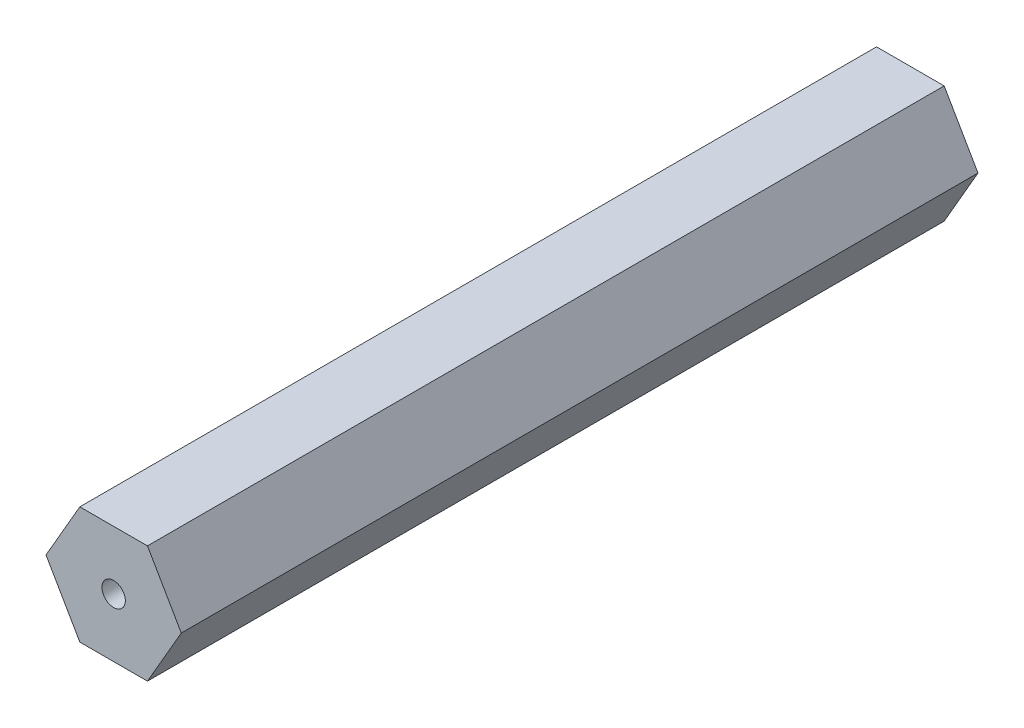
ISO-10303-21;
HEADER;
FILE_DESCRIPTION(('STEP AP214'),'2;1');
FILE_NAME('part.step','',(''),(''),'','','');
FILE_SCHEMA(('AUTOMOTIVE_DESIGN { 1 0 10303 214 1 1 1 1 }'));
ENDSEC;
DATA;
#1=APPLICATION_CONTEXT('core data for automotive mechanical design processes');
#2=APPLICATION_PROTOCOL_DEFINITION('international standard','automotive_design',2000,#1);
#3=PRODUCT_CONTEXT('',#1,'mechanical');
#4=PRODUCT('Part','Part','',(#3));
#5=PRODUCT_RELATED_PRODUCT_CATEGORY('part','',(#4));
#6=PRODUCT_DEFINITION_FORMATION('','',#4);
#7=PRODUCT_DEFINITION_CONTEXT('part definition',#1,'design');
#8=PRODUCT_DEFINITION('design','',#6,#7);
#9=PRODUCT_DEFINITION_SHAPE('','',#8);
#10=(LENGTH_UNIT() NAMED_UNIT(*) SI_UNIT(.MILLI.,.METRE.));
#11=(NAMED_UNIT(*) PLANE_ANGLE_UNIT() SI_UNIT($,.RADIAN.));
#12=(NAMED_UNIT(*) SI_UNIT($,.STERADIAN.) SOLID_ANGLE_UNIT());
#13=UNCERTAINTY_MEASURE_WITH_UNIT(LENGTH_MEASURE(1.E-05),#10,'distance_accuracy_value','');
#14=(GEOMETRIC_REPRESENTATION_CONTEXT(3) GLOBAL_UNCERTAINTY_ASSIGNED_CONTEXT((#13)) GLOBAL_UNIT_ASSIGNED_CONTEXT((#10,
#11,#12)) REPRESENTATION_CONTEXT('',''));
#15=CARTESIAN_POINT('',(0.,0.,0.));
#16=DIRECTION('',(0.,0.,1.));
#17=DIRECTION('',(1.,0.,0.));
#18=AXIS2_PLACEMENT_3D('',#15,#16,#17);
#19=CARTESIAN_POINT('',(0.,0.,86.36));
#20=DIRECTION('',(0.,0.,1.));
#21=DIRECTION('',(1.,0.,0.));
#22=AXIS2_PLACEMENT_3D('',#19,#20,#21);
#23=PLANE('',#22);
#24=DIRECTION('',(0.499999999999995,0.866025403784441,0.));
#25=VECTOR('',#24,1.);
#26=CARTESIAN_POINT('',(4.76927087411562,-5.16579328635903,86.36));
#27=LINE('',#26,#25);
#28=CARTESIAN_POINT('',(4.76927087411562,-5.16579328635903,86.36));
#29=VERTEX_POINT('',#28);
#30=CARTESIAN_POINT('',(8.43544508346967,1.18420671364094,86.36));
#31=VERTEX_POINT('',#30);
#32=EDGE_CURVE('E150',#29,#31,#27,.T.);
#33=ORIENTED_EDGE('',*,*,#32,.T.);
#34=DIRECTION('',(-0.500000000000001,0.866025403784438,0.));
#35=VECTOR('',#34,1.);
#36=CARTESIAN_POINT('',(8.43544508346967,1.18420671364094,86.36));
#37=LINE('',#36,#35);
#38=CARTESIAN_POINT('',(4.76927087411553,7.53420671364095,86.36));
#39=VERTEX_POINT('',#38);
#40=EDGE_CURVE('E98',#31,#39,#37,.T.);
#41=ORIENTED_EDGE('',*,*,#40,.T.);
#42=DIRECTION('',(-1.,0.,0.));
#43=VECTOR('',#42,1.);
#44=CARTESIAN_POINT('',(4.76927087411553,7.53420671364095,86.36));
#45=LINE('',#44,#43);
#46=CARTESIAN_POINT('',(-2.56307754459274,7.53420671364093,86.36));
#47=VERTEX_POINT('',#46);
#48=EDGE_CURVE('E111',#39,#47,#45,.T.);
#49=ORIENTED_EDGE('',*,*,#48,.T.);
#50=DIRECTION('',(-0.499999999999995,-0.866025403784441,0.));
#51=VECTOR('',#50,1.);
#52=CARTESIAN_POINT('',(-2.56307754459274,7.53420671364093,86.36));
#53=LINE('',#52,#51);
#54=CARTESIAN_POINT('',(-6.22925175394683,1.18420671364089,86.36));
#55=VERTEX_POINT('',#54);
#56=EDGE_CURVE('E105',#47,#55,#53,.T.);
#57=ORIENTED_EDGE('',*,*,#56,.T.);
#58=DIRECTION('',(0.500000000000007,-0.866025403784435,0.));
#59=VECTOR('',#58,1.);
#60=CARTESIAN_POINT('',(-6.22925175394683,1.18420671364089,86.36));
#61=LINE('',#60,#59);
#62=CARTESIAN_POINT('',(-2.56307754459265,-5.1657932863591,86.36));
#63=VERTEX_POINT('',#62);
#64=EDGE_CURVE('E109',#55,#63,#61,.T.);
#65=ORIENTED_EDGE('',*,*,#64,.T.);
#66=DIRECTION('',(1.,0.,0.));
#67=VECTOR('',#66,1.);
#68=CARTESIAN_POINT('',(-2.56307754459265,-5.1657932863591,86.36));
#69=LINE('',#68,#67);
#70=EDGE_CURVE('E61',#63,#29,#69,.T.);
#71=ORIENTED_EDGE('',*,*,#70,.T.);
#72=EDGE_LOOP('',(#33,#41,#49,#57,#65,#71));
#73=FACE_BOUND('',#72,.T.);
#74=CARTESIAN_POINT('',(1.10309666476142,1.18420671364094,86.36));
#75=DIRECTION('',(0.,0.,1.));
#76=DIRECTION('',(1.,0.,0.));
#77=AXIS2_PLACEMENT_3D('',#74,#75,#76);
#78=CIRCLE('',#77,1.27);
#79=CARTESIAN_POINT('',(2.37309666476142,1.18420671364094,86.36));
#80=VERTEX_POINT('',#79);
#81=EDGE_CURVE('E138',#80,#80,#78,.T.);
#82=ORIENTED_EDGE('',*,*,#81,.F.);
#83=EDGE_LOOP('',(#82));
#84=FACE_BOUND('',#83,.T.);
#85=ADVANCED_FACE('F43',(#73,#84),#23,.T.);
#86=CARTESIAN_POINT('',(0.,0.,0.));
#87=DIRECTION('',(0.,0.,1.));
#88=DIRECTION('',(1.,0.,0.));
#89=AXIS2_PLACEMENT_3D('',#86,#87,#88);
#90=PLANE('',#89);
#91=DIRECTION('',(0.499999999999995,0.866025403784441,0.));
#92=VECTOR('',#91,1.);
#93=CARTESIAN_POINT('',(4.76927087411562,-5.16579328635903,0.));
#94=LINE('',#93,#92);
#95=CARTESIAN_POINT('',(4.76927087411562,-5.16579328635903,0.));
#96=VERTEX_POINT('',#95);
#97=CARTESIAN_POINT('',(8.43544508346967,1.18420671364094,0.));
#98=VERTEX_POINT('',#97);
#99=EDGE_CURVE('E133',#96,#98,#94,.T.);
#100=ORIENTED_EDGE('',*,*,#99,.F.);
#101=DIRECTION('',(1.,0.,0.));
#102=VECTOR('',#101,1.);
#103=CARTESIAN_POINT('',(-2.56307754459265,-5.1657932863591,0.));
#104=LINE('',#103,#102);
#105=CARTESIAN_POINT('',(-2.56307754459265,-5.1657932863591,0.));
#106=VERTEX_POINT('',#105);
#107=EDGE_CURVE('E90',#106,#96,#104,.T.);
#108=ORIENTED_EDGE('',*,*,#107,.F.);
#109=DIRECTION('',(0.500000000000007,-0.866025403784435,0.));
#110=VECTOR('',#109,1.);
#111=CARTESIAN_POINT('',(-6.22925175394683,1.18420671364089,0.));
#112=LINE('',#111,#110);
#113=CARTESIAN_POINT('',(-6.22925175394683,1.18420671364089,0.));
#114=VERTEX_POINT('',#113);
#115=EDGE_CURVE('E84',#114,#106,#112,.T.);
#116=ORIENTED_EDGE('',*,*,#115,.F.);
#117=DIRECTION('',(-0.499999999999995,-0.866025403784441,0.));
#118=VECTOR('',#117,1.);
#119=CARTESIAN_POINT('',(-2.56307754459274,7.53420671364093,0.));
#120=LINE('',#119,#118);
#121=CARTESIAN_POINT('',(-2.56307754459274,7.53420671364093,0.));
#122=VERTEX_POINT('',#121);
#123=EDGE_CURVE('E120',#122,#114,#120,.T.);
#124=ORIENTED_EDGE('',*,*,#123,.F.);
#125=DIRECTION('',(-1.,0.,0.));
#126=VECTOR('',#125,1.);
#127=CARTESIAN_POINT('',(4.76927087411553,7.53420671364095,0.));
#128=LINE('',#127,#126);
#129=CARTESIAN_POINT('',(4.76927087411553,7.53420671364095,0.));
#130=VERTEX_POINT('',#129);
#131=EDGE_CURVE('E141',#130,#122,#128,.T.);
#132=ORIENTED_EDGE('',*,*,#131,.F.);
#133=DIRECTION('',(-0.500000000000001,0.866025403784438,0.));
#134=VECTOR('',#133,1.);
#135=CARTESIAN_POINT('',(8.43544508346967,1.18420671364094,0.));
#136=LINE('',#135,#134);
#137=EDGE_CURVE('E137',#98,#130,#136,.T.);
#138=ORIENTED_EDGE('',*,*,#137,.F.);
#139=EDGE_LOOP('',(#100,#108,#116,#124,#132,#138));
#140=FACE_BOUND('',#139,.T.);
#141=CARTESIAN_POINT('',(1.10309666476142,1.18420671364094,0.));
#142=DIRECTION('',(0.,0.,1.));
#143=DIRECTION('',(1.,0.,0.));
#144=AXIS2_PLACEMENT_3D('',#141,#142,#143);
#145=CIRCLE('',#144,1.27);
#146=CARTESIAN_POINT('',(2.37309666476142,1.18420671364094,0.));
#147=VERTEX_POINT('',#146);
#148=EDGE_CURVE('E265',#147,#147,#145,.T.);
#149=ORIENTED_EDGE('',*,*,#148,.T.);
#150=EDGE_LOOP('',(#149));
#151=FACE_BOUND('',#150,.T.);
#152=ADVANCED_FACE('F163',(#140,#151),#90,.F.);
#153=CARTESIAN_POINT('',(4.76927087411562,-5.16579328635903,86.36));
#154=DIRECTION('',(-0.866025403784441,0.499999999999995,0.));
#155=DIRECTION('',(-0.499999999999995,-0.866025403784442,0.));
#156=AXIS2_PLACEMENT_3D('',#153,#154,#155);
#157=PLANE('',#156);
#158=ORIENTED_EDGE('',*,*,#99,.T.);
#159=DIRECTION('',(0.,0.,-1.));
#160=VECTOR('',#159,1.);
#161=CARTESIAN_POINT('',(8.43544508346967,1.18420671364094,86.36));
#162=LINE('',#161,#160);
#163=EDGE_CURVE('E11',#31,#98,#162,.T.);
#164=ORIENTED_EDGE('',*,*,#163,.F.);
#165=ORIENTED_EDGE('',*,*,#32,.F.);
#166=DIRECTION('',(0.,0.,-1.));
#167=VECTOR('',#166,1.);
#168=CARTESIAN_POINT('',(4.76927087411562,-5.16579328635903,86.36));
#169=LINE('',#168,#167);
#170=EDGE_CURVE('E129',#29,#96,#169,.T.);
#171=ORIENTED_EDGE('',*,*,#170,.T.);
#172=EDGE_LOOP('',(#158,#164,#165,#171));
#173=FACE_BOUND('',#172,.T.);
#174=ADVANCED_FACE('F45',(#173),#157,.F.);
#175=CARTESIAN_POINT('',(8.43544508346967,1.18420671364094,86.36));
#176=DIRECTION('',(-0.866025403784438,-0.500000000000001,0.));
#177=DIRECTION('',(0.500000000000001,-0.866025403784438,0.));
#178=AXIS2_PLACEMENT_3D('',#175,#176,#177);
#179=PLANE('',#178);
#180=ORIENTED_EDGE('',*,*,#137,.T.);
#181=DIRECTION('',(0.,0.,-1.));
#182=VECTOR('',#181,1.);
#183=CARTESIAN_POINT('',(4.76927087411553,7.53420671364095,86.36));
#184=LINE('',#183,#182);
#185=EDGE_CURVE('E53',#39,#130,#184,.T.);
#186=ORIENTED_EDGE('',*,*,#185,.F.);
#187=ORIENTED_EDGE('',*,*,#40,.F.);
#188=ORIENTED_EDGE('',*,*,#163,.T.);
#189=EDGE_LOOP('',(#180,#186,#187,#188));
#190=FACE_BOUND('',#189,.T.);
#191=ADVANCED_FACE('F188',(#190),#179,.F.);
#192=CARTESIAN_POINT('',(4.76927087411553,7.53420671364095,86.36));
#193=DIRECTION('',(0.,-1.,0.));
#194=DIRECTION('',(1.,0.,0.));
#195=AXIS2_PLACEMENT_3D('',#192,#193,#194);
#196=PLANE('',#195);
#197=ORIENTED_EDGE('',*,*,#131,.T.);
#198=DIRECTION('',(0.,0.,-1.));
#199=VECTOR('',#198,1.);
#200=CARTESIAN_POINT('',(-2.56307754459274,7.53420671364093,86.36));
#201=LINE('',#200,#199);
#202=EDGE_CURVE('E122',#47,#122,#201,.T.);
#203=ORIENTED_EDGE('',*,*,#202,.F.);
#204=ORIENTED_EDGE('',*,*,#48,.F.);
#205=ORIENTED_EDGE('',*,*,#185,.T.);
#206=EDGE_LOOP('',(#197,#203,#204,#205));
#207=FACE_BOUND('',#206,.T.);
#208=ADVANCED_FACE('F160',(#207),#196,.F.);
#209=CARTESIAN_POINT('',(-2.56307754459274,7.53420671364093,86.36));
#210=DIRECTION('',(0.866025403784441,-0.499999999999995,0.));
#211=DIRECTION('',(0.499999999999995,0.866025403784442,0.));
#212=AXIS2_PLACEMENT_3D('',#209,#210,#211);
#213=PLANE('',#212);
#214=ORIENTED_EDGE('',*,*,#123,.T.);
#215=DIRECTION('',(0.,0.,-1.));
#216=VECTOR('',#215,1.);
#217=CARTESIAN_POINT('',(-6.22925175394683,1.18420671364089,86.36));
#218=LINE('',#217,#216);
#219=EDGE_CURVE('E117',#55,#114,#218,.T.);
#220=ORIENTED_EDGE('',*,*,#219,.F.);
#221=ORIENTED_EDGE('',*,*,#56,.F.);
#222=ORIENTED_EDGE('',*,*,#202,.T.);
#223=EDGE_LOOP('',(#214,#220,#221,#222));
#224=FACE_BOUND('',#223,.T.);
#225=ADVANCED_FACE('F118',(#224),#213,.F.);
#226=CARTESIAN_POINT('',(-6.22925175394683,1.18420671364089,86.36));
#227=DIRECTION('',(0.866025403784435,0.500000000000007,0.));
#228=DIRECTION('',(-0.500000000000007,0.866025403784435,0.));
#229=AXIS2_PLACEMENT_3D('',#226,#227,#228);
#230=PLANE('',#229);
#231=ORIENTED_EDGE('',*,*,#115,.T.);
#232=DIRECTION('',(0.,0.,-1.));
#233=VECTOR('',#232,1.);
#234=CARTESIAN_POINT('',(-2.56307754459265,-5.1657932863591,86.36));
#235=LINE('',#234,#233);
#236=EDGE_CURVE('E123',#63,#106,#235,.T.);
#237=ORIENTED_EDGE('',*,*,#236,.F.);
#238=ORIENTED_EDGE('',*,*,#64,.F.);
#239=ORIENTED_EDGE('',*,*,#219,.T.);
#240=EDGE_LOOP('',(#231,#237,#238,#239));
#241=FACE_BOUND('',#240,.T.);
#242=ADVANCED_FACE('F125',(#241),#230,.F.);
#243=CARTESIAN_POINT('',(-2.56307754459265,-5.1657932863591,86.36));
#244=DIRECTION('',(0.,1.,0.));
#245=DIRECTION('',(-1.,0.,0.));
#246=AXIS2_PLACEMENT_3D('',#243,#244,#245);
#247=PLANE('',#246);
#248=ORIENTED_EDGE('',*,*,#107,.T.);
#249=ORIENTED_EDGE('',*,*,#170,.F.);
#250=ORIENTED_EDGE('',*,*,#70,.F.);
#251=ORIENTED_EDGE('',*,*,#236,.T.);
#252=EDGE_LOOP('',(#248,#249,#250,#251));
#253=FACE_BOUND('',#252,.T.);
#254=ADVANCED_FACE('F168',(#253),#247,.F.);
#255=CARTESIAN_POINT('',(1.10309666476142,1.18420671364094,86.36));
#256=DIRECTION('',(0.,0.,-1.));
#257=DIRECTION('',(-1.,0.,0.));
#258=AXIS2_PLACEMENT_3D('',#255,#256,#257);
#259=CYLINDRICAL_SURFACE('',#258,1.27);
#260=ORIENTED_EDGE('',*,*,#81,.T.);
#261=EDGE_LOOP('',(#260));
#262=FACE_BOUND('',#261,.T.);
#263=ORIENTED_EDGE('',*,*,#148,.F.);
#264=EDGE_LOOP('',(#263));
#265=FACE_BOUND('',#264,.T.);
#266=ADVANCED_FACE('F170',(#262,#265),#259,.F.);
#267=CLOSED_SHELL('',(#85,#152,#174,#191,#208,#225,#242,#254,#266));
#268=MANIFOLD_SOLID_BREP('B2',#267);
#269=ADVANCED_BREP_SHAPE_REPRESENTATION('',(#18,#268),#14);
#270=SHAPE_DEFINITION_REPRESENTATION(#9,#269);
ENDSEC;
END-ISO-10303-21;
